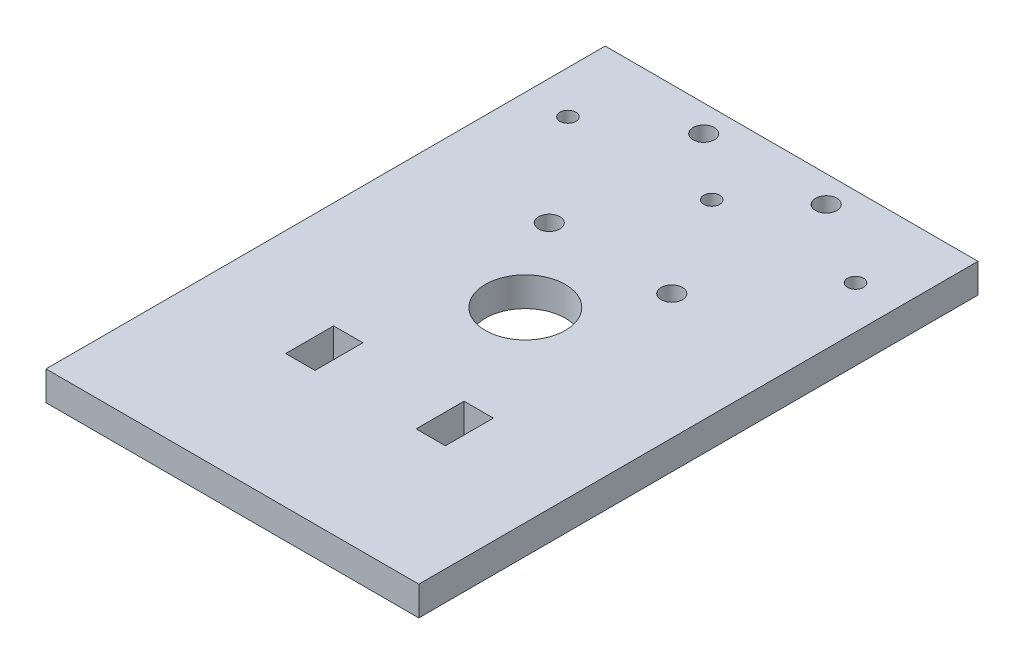
ISO-10303-21;
HEADER;
FILE_DESCRIPTION(('STEP AP214'),'2;1');
FILE_NAME('part.step','',(''),(''),'','','');
FILE_SCHEMA(('AUTOMOTIVE_DESIGN { 1 0 10303 214 1 1 1 1 }'));
ENDSEC;
DATA;
#1=APPLICATION_CONTEXT('core data for automotive mechanical design processes');
#2=APPLICATION_PROTOCOL_DEFINITION('international standard','automotive_design',2000,#1);
#3=PRODUCT_CONTEXT('',#1,'mechanical');
#4=PRODUCT('Part','Part','',(#3));
#5=PRODUCT_RELATED_PRODUCT_CATEGORY('part','',(#4));
#6=PRODUCT_DEFINITION_FORMATION('','',#4);
#7=PRODUCT_DEFINITION_CONTEXT('part definition',#1,'design');
#8=PRODUCT_DEFINITION('design','',#6,#7);
#9=PRODUCT_DEFINITION_SHAPE('','',#8);
#10=(LENGTH_UNIT() NAMED_UNIT(*) SI_UNIT(.MILLI.,.METRE.));
#11=(NAMED_UNIT(*) PLANE_ANGLE_UNIT() SI_UNIT($,.RADIAN.));
#12=(NAMED_UNIT(*) SI_UNIT($,.STERADIAN.) SOLID_ANGLE_UNIT());
#13=UNCERTAINTY_MEASURE_WITH_UNIT(LENGTH_MEASURE(1.E-05),#10,'distance_accuracy_value','');
#14=(GEOMETRIC_REPRESENTATION_CONTEXT(3) GLOBAL_UNCERTAINTY_ASSIGNED_CONTEXT((#13)) GLOBAL_UNIT_ASSIGNED_CONTEXT((#10,
#11,#12)) REPRESENTATION_CONTEXT('',''));
#15=CARTESIAN_POINT('',(0.,0.,0.));
#16=DIRECTION('',(0.,0.,1.));
#17=DIRECTION('',(1.,0.,0.));
#18=AXIS2_PLACEMENT_3D('',#15,#16,#17);
#19=CARTESIAN_POINT('',(0.,5.5,0.));
#20=DIRECTION('',(0.,1.,0.));
#21=DIRECTION('',(0.,0.,1.));
#22=AXIS2_PLACEMENT_3D('',#19,#20,#21);
#23=PLANE('',#22);
#24=CARTESIAN_POINT('',(-44.4065040650406,5.5,8.92276422764227));
#25=DIRECTION('',(0.,1.,0.));
#26=DIRECTION('',(0.,0.,-1.));
#27=AXIS2_PLACEMENT_3D('',#24,#25,#26);
#28=CIRCLE('',#27,1.5);
#29=CARTESIAN_POINT('',(-44.4065040650406,5.5,7.42276422764227));
#30=VERTEX_POINT('',#29);
#31=EDGE_CURVE('E327',#30,#30,#28,.T.);
#32=ORIENTED_EDGE('',*,*,#31,.F.);
#33=EDGE_LOOP('',(#32));
#34=FACE_BOUND('',#33,.T.);
#35=DIRECTION('',(1.,0.,0.));
#36=VECTOR('',#35,1.);
#37=CARTESIAN_POINT('',(-56.4065040650406,5.5,73.9227642276423));
#38=LINE('',#37,#36);
#39=CARTESIAN_POINT('',(-61.9065040650406,5.5,73.9227642276423));
#40=VERTEX_POINT('',#39);
#41=CARTESIAN_POINT('',(-56.4065040650406,5.5,73.9227642276423));
#42=VERTEX_POINT('',#41);
#43=EDGE_CURVE('E130',#40,#42,#38,.T.);
#44=ORIENTED_EDGE('',*,*,#43,.F.);
#45=DIRECTION('',(0.,0.,1.));
#46=VECTOR('',#45,1.);
#47=CARTESIAN_POINT('',(-61.9065040650406,5.5,73.9227642276423));
#48=LINE('',#47,#46);
#49=CARTESIAN_POINT('',(-61.9065040650406,5.5,64.9227642276423));
#50=VERTEX_POINT('',#49);
#51=EDGE_CURVE('E122',#50,#40,#48,.T.);
#52=ORIENTED_EDGE('',*,*,#51,.F.);
#53=DIRECTION('',(-1.,0.,0.));
#54=VECTOR('',#53,1.);
#55=CARTESIAN_POINT('',(-61.9065040650406,5.5,64.9227642276423));
#56=LINE('',#55,#54);
#57=CARTESIAN_POINT('',(-56.4065040650406,5.5,64.9227642276423));
#58=VERTEX_POINT('',#57);
#59=EDGE_CURVE('E145',#58,#50,#56,.T.);
#60=ORIENTED_EDGE('',*,*,#59,.F.);
#61=DIRECTION('',(0.,0.,-1.));
#62=VECTOR('',#61,1.);
#63=CARTESIAN_POINT('',(-56.4065040650406,5.5,64.9227642276423));
#64=LINE('',#63,#62);
#65=EDGE_CURVE('E143',#42,#58,#64,.T.);
#66=ORIENTED_EDGE('',*,*,#65,.F.);
#67=EDGE_LOOP('',(#44,#52,#60,#66));
#68=FACE_BOUND('',#67,.T.);
#69=DIRECTION('',(1.,0.,0.));
#70=VECTOR('',#69,1.);
#71=CARTESIAN_POINT('',(-86.4065040650406,5.5,73.9227642276423));
#72=LINE('',#71,#70);
#73=CARTESIAN_POINT('',(-86.4065040650406,5.5,73.9227642276423));
#74=VERTEX_POINT('',#73);
#75=CARTESIAN_POINT('',(-80.9065040650406,5.5,73.9227642276423));
#76=VERTEX_POINT('',#75);
#77=EDGE_CURVE('E163',#74,#76,#72,.T.);
#78=ORIENTED_EDGE('',*,*,#77,.F.);
#79=DIRECTION('',(0.,0.,1.));
#80=VECTOR('',#79,1.);
#81=CARTESIAN_POINT('',(-86.4065040650406,5.5,64.9227642276423));
#82=LINE('',#81,#80);
#83=CARTESIAN_POINT('',(-86.4065040650406,5.5,64.9227642276423));
#84=VERTEX_POINT('',#83);
#85=EDGE_CURVE('E161',#84,#74,#82,.T.);
#86=ORIENTED_EDGE('',*,*,#85,.F.);
#87=DIRECTION('',(-1.,0.,0.));
#88=VECTOR('',#87,1.);
#89=CARTESIAN_POINT('',(-80.9065040650406,5.5,64.9227642276423));
#90=LINE('',#89,#88);
#91=CARTESIAN_POINT('',(-80.9065040650406,5.5,64.9227642276423));
#92=VERTEX_POINT('',#91);
#93=EDGE_CURVE('E169',#92,#84,#90,.T.);
#94=ORIENTED_EDGE('',*,*,#93,.F.);
#95=DIRECTION('',(0.,0.,-1.));
#96=VECTOR('',#95,1.);
#97=CARTESIAN_POINT('',(-80.9065040650406,5.5,73.9227642276423));
#98=LINE('',#97,#96);
#99=EDGE_CURVE('E166',#76,#92,#98,.T.);
#100=ORIENTED_EDGE('',*,*,#99,.F.);
#101=EDGE_LOOP('',(#78,#86,#94,#100));
#102=FACE_BOUND('',#101,.T.);
#103=CARTESIAN_POINT('',(-71.4065040650406,5.5,43.9227642276423));
#104=DIRECTION('',(0.,1.,0.));
#105=DIRECTION('',(0.,0.,1.));
#106=AXIS2_PLACEMENT_3D('',#103,#104,#105);
#107=CIRCLE('',#106,7.5);
#108=CARTESIAN_POINT('',(-71.4065040650406,5.5,51.4227642276423));
#109=VERTEX_POINT('',#108);
#110=EDGE_CURVE('E192',#109,#109,#107,.T.);
#111=ORIENTED_EDGE('',*,*,#110,.F.);
#112=EDGE_LOOP('',(#111));
#113=FACE_BOUND('',#112,.T.);
#114=CARTESIAN_POINT('',(-59.9065040650406,5.5,27.9227642276423));
#115=DIRECTION('',(0.,1.,0.));
#116=DIRECTION('',(0.,0.,-1.));
#117=AXIS2_PLACEMENT_3D('',#114,#115,#116);
#118=CIRCLE('',#117,2.);
#119=CARTESIAN_POINT('',(-59.9065040650406,5.5,25.9227642276423));
#120=VERTEX_POINT('',#119);
#121=EDGE_CURVE('E204',#120,#120,#118,.T.);
#122=ORIENTED_EDGE('',*,*,#121,.F.);
#123=EDGE_LOOP('',(#122));
#124=FACE_BOUND('',#123,.T.);
#125=CARTESIAN_POINT('',(-82.9065040650406,5.5,27.9227642276423));
#126=DIRECTION('',(0.,1.,0.));
#127=DIRECTION('',(0.,0.,1.));
#128=AXIS2_PLACEMENT_3D('',#125,#126,#127);
#129=CIRCLE('',#128,2.);
#130=CARTESIAN_POINT('',(-82.9065040650406,5.5,29.9227642276423));
#131=VERTEX_POINT('',#130);
#132=EDGE_CURVE('E216',#131,#131,#129,.T.);
#133=ORIENTED_EDGE('',*,*,#132,.F.);
#134=EDGE_LOOP('',(#133));
#135=FACE_BOUND('',#134,.T.);
#136=DIRECTION('',(0.,0.,1.));
#137=VECTOR('',#136,1.);
#138=CARTESIAN_POINT('',(-106.406504065041,5.5,-6.07723577235772));
#139=LINE('',#138,#137);
#140=CARTESIAN_POINT('',(-106.406504065041,5.5,-6.07723577235772));
#141=VERTEX_POINT('',#140);
#142=CARTESIAN_POINT('',(-106.406504065041,5.5,98.9227642276423));
#143=VERTEX_POINT('',#142);
#144=EDGE_CURVE('E222',#141,#143,#139,.T.);
#145=ORIENTED_EDGE('',*,*,#144,.T.);
#146=DIRECTION('',(1.,0.,0.));
#147=VECTOR('',#146,1.);
#148=CARTESIAN_POINT('',(-106.406504065041,5.5,98.9227642276423));
#149=LINE('',#148,#147);
#150=CARTESIAN_POINT('',(-36.4065040650406,5.5,98.9227642276423));
#151=VERTEX_POINT('',#150);
#152=EDGE_CURVE('E225',#143,#151,#149,.T.);
#153=ORIENTED_EDGE('',*,*,#152,.T.);
#154=DIRECTION('',(0.,0.,-1.));
#155=VECTOR('',#154,1.);
#156=CARTESIAN_POINT('',(-36.4065040650406,5.5,98.9227642276423));
#157=LINE('',#156,#155);
#158=CARTESIAN_POINT('',(-36.4065040650406,5.5,-6.07723577235773));
#159=VERTEX_POINT('',#158);
#160=EDGE_CURVE('E228',#151,#159,#157,.T.);
#161=ORIENTED_EDGE('',*,*,#160,.T.);
#162=DIRECTION('',(-1.,0.,0.));
#163=VECTOR('',#162,1.);
#164=CARTESIAN_POINT('',(-106.406504065041,5.5,-6.07723577235772));
#165=LINE('',#164,#163);
#166=EDGE_CURVE('E230',#159,#141,#165,.T.);
#167=ORIENTED_EDGE('',*,*,#166,.T.);
#168=EDGE_LOOP('',(#145,#153,#161,#167));
#169=FACE_BOUND('',#168,.T.);
#170=CARTESIAN_POINT('',(-82.9065040650406,5.5,-1.07723577235772));
#171=DIRECTION('',(0.,1.,0.));
#172=DIRECTION('',(0.,0.,1.));
#173=AXIS2_PLACEMENT_3D('',#170,#171,#172);
#174=CIRCLE('',#173,2.);
#175=CARTESIAN_POINT('',(-82.9065040650406,5.5,0.922764227642278));
#176=VERTEX_POINT('',#175);
#177=EDGE_CURVE('E210',#176,#176,#174,.T.);
#178=ORIENTED_EDGE('',*,*,#177,.F.);
#179=EDGE_LOOP('',(#178));
#180=FACE_BOUND('',#179,.T.);
#181=CARTESIAN_POINT('',(-59.9065040650406,5.5,-1.07723577235772));
#182=DIRECTION('',(0.,1.,0.));
#183=DIRECTION('',(0.,0.,-1.));
#184=AXIS2_PLACEMENT_3D('',#181,#182,#183);
#185=CIRCLE('',#184,2.);
#186=CARTESIAN_POINT('',(-59.9065040650406,5.5,-3.07723577235772));
#187=VERTEX_POINT('',#186);
#188=EDGE_CURVE('E198',#187,#187,#185,.T.);
#189=ORIENTED_EDGE('',*,*,#188,.F.);
#190=EDGE_LOOP('',(#189));
#191=FACE_BOUND('',#190,.T.);
#192=CARTESIAN_POINT('',(-71.4065040650406,5.5,8.92276422764228));
#193=DIRECTION('',(0.,1.,0.));
#194=DIRECTION('',(0.,0.,1.));
#195=AXIS2_PLACEMENT_3D('',#192,#193,#194);
#196=CIRCLE('',#195,1.5);
#197=CARTESIAN_POINT('',(-71.4065040650406,5.5,10.4227642276423));
#198=VERTEX_POINT('',#197);
#199=EDGE_CURVE('E151',#198,#198,#196,.T.);
#200=ORIENTED_EDGE('',*,*,#199,.F.);
#201=EDGE_LOOP('',(#200));
#202=FACE_BOUND('',#201,.T.);
#203=CARTESIAN_POINT('',(-98.4065040650407,5.5,8.92276422764228));
#204=DIRECTION('',(0.,1.,0.));
#205=DIRECTION('',(0.,0.,1.));
#206=AXIS2_PLACEMENT_3D('',#203,#204,#205);
#207=CIRCLE('',#206,1.5);
#208=CARTESIAN_POINT('',(-98.4065040650407,5.5,10.4227642276423));
#209=VERTEX_POINT('',#208);
#210=EDGE_CURVE('E322',#209,#209,#207,.T.);
#211=ORIENTED_EDGE('',*,*,#210,.F.);
#212=EDGE_LOOP('',(#211));
#213=FACE_BOUND('',#212,.T.);
#214=ADVANCED_FACE('F33',(#34,#68,#102,#113,#124,#135,#169,#180,#191,#202,#213),#23,.T.);
#215=CARTESIAN_POINT('',(0.,0.,0.));
#216=DIRECTION('',(0.,1.,0.));
#217=DIRECTION('',(0.,0.,1.));
#218=AXIS2_PLACEMENT_3D('',#215,#216,#217);
#219=PLANE('',#218);
#220=DIRECTION('',(0.,0.,1.));
#221=VECTOR('',#220,1.);
#222=CARTESIAN_POINT('',(-86.4065040650406,0.,64.9227642276423));
#223=LINE('',#222,#221);
#224=CARTESIAN_POINT('',(-86.4065040650406,0.,64.9227642276423));
#225=VERTEX_POINT('',#224);
#226=CARTESIAN_POINT('',(-86.4065040650406,0.,73.9227642276423));
#227=VERTEX_POINT('',#226);
#228=EDGE_CURVE('E138',#225,#227,#223,.T.);
#229=ORIENTED_EDGE('',*,*,#228,.T.);
#230=DIRECTION('',(1.,0.,0.));
#231=VECTOR('',#230,1.);
#232=CARTESIAN_POINT('',(-86.4065040650406,0.,73.9227642276423));
#233=LINE('',#232,#231);
#234=CARTESIAN_POINT('',(-80.9065040650406,0.,73.9227642276423));
#235=VERTEX_POINT('',#234);
#236=EDGE_CURVE('E174',#227,#235,#233,.T.);
#237=ORIENTED_EDGE('',*,*,#236,.T.);
#238=DIRECTION('',(0.,0.,-1.));
#239=VECTOR('',#238,1.);
#240=CARTESIAN_POINT('',(-80.9065040650406,0.,73.9227642276423));
#241=LINE('',#240,#239);
#242=CARTESIAN_POINT('',(-80.9065040650406,0.,64.9227642276423));
#243=VERTEX_POINT('',#242);
#244=EDGE_CURVE('E177',#235,#243,#241,.T.);
#245=ORIENTED_EDGE('',*,*,#244,.T.);
#246=DIRECTION('',(-1.,0.,0.));
#247=VECTOR('',#246,1.);
#248=CARTESIAN_POINT('',(-80.9065040650406,0.,64.9227642276423));
#249=LINE('',#248,#247);
#250=EDGE_CURVE('E164',#243,#225,#249,.T.);
#251=ORIENTED_EDGE('',*,*,#250,.T.);
#252=EDGE_LOOP('',(#229,#237,#245,#251));
#253=FACE_BOUND('',#252,.T.);
#254=DIRECTION('',(0.,0.,1.));
#255=VECTOR('',#254,1.);
#256=CARTESIAN_POINT('',(-106.406504065041,0.,-6.07723577235772));
#257=LINE('',#256,#255);
#258=CARTESIAN_POINT('',(-106.406504065041,0.,-6.07723577235772));
#259=VERTEX_POINT('',#258);
#260=CARTESIAN_POINT('',(-106.406504065041,0.,98.9227642276423));
#261=VERTEX_POINT('',#260);
#262=EDGE_CURVE('E219',#259,#261,#257,.T.);
#263=ORIENTED_EDGE('',*,*,#262,.F.);
#264=DIRECTION('',(-1.,0.,0.));
#265=VECTOR('',#264,1.);
#266=CARTESIAN_POINT('',(-106.406504065041,0.,-6.07723577235772));
#267=LINE('',#266,#265);
#268=CARTESIAN_POINT('',(-36.4065040650406,0.,-6.07723577235773));
#269=VERTEX_POINT('',#268);
#270=EDGE_CURVE('E226',#269,#259,#267,.T.);
#271=ORIENTED_EDGE('',*,*,#270,.F.);
#272=DIRECTION('',(0.,0.,-1.));
#273=VECTOR('',#272,1.);
#274=CARTESIAN_POINT('',(-36.4065040650406,0.,98.9227642276423));
#275=LINE('',#274,#273);
#276=CARTESIAN_POINT('',(-36.4065040650406,0.,98.9227642276423));
#277=VERTEX_POINT('',#276);
#278=EDGE_CURVE('E237',#277,#269,#275,.T.);
#279=ORIENTED_EDGE('',*,*,#278,.F.);
#280=DIRECTION('',(1.,0.,0.));
#281=VECTOR('',#280,1.);
#282=CARTESIAN_POINT('',(-106.406504065041,0.,98.9227642276423));
#283=LINE('',#282,#281);
#284=EDGE_CURVE('E235',#261,#277,#283,.T.);
#285=ORIENTED_EDGE('',*,*,#284,.F.);
#286=EDGE_LOOP('',(#263,#271,#279,#285));
#287=FACE_BOUND('',#286,.T.);
#288=CARTESIAN_POINT('',(-82.9065040650406,0.,27.9227642276423));
#289=DIRECTION('',(0.,1.,0.));
#290=DIRECTION('',(0.,0.,1.));
#291=AXIS2_PLACEMENT_3D('',#288,#289,#290);
#292=CIRCLE('',#291,2.);
#293=CARTESIAN_POINT('',(-82.9065040650406,0.,29.9227642276423));
#294=VERTEX_POINT('',#293);
#295=EDGE_CURVE('E213',#294,#294,#292,.T.);
#296=ORIENTED_EDGE('',*,*,#295,.T.);
#297=EDGE_LOOP('',(#296));
#298=FACE_BOUND('',#297,.T.);
#299=CARTESIAN_POINT('',(-82.9065040650406,0.,-1.07723577235772));
#300=DIRECTION('',(0.,1.,0.));
#301=DIRECTION('',(0.,0.,1.));
#302=AXIS2_PLACEMENT_3D('',#299,#300,#301);
#303=CIRCLE('',#302,2.);
#304=CARTESIAN_POINT('',(-82.9065040650406,0.,0.922764227642278));
#305=VERTEX_POINT('',#304);
#306=EDGE_CURVE('E207',#305,#305,#303,.T.);
#307=ORIENTED_EDGE('',*,*,#306,.T.);
#308=EDGE_LOOP('',(#307));
#309=FACE_BOUND('',#308,.T.);
#310=CARTESIAN_POINT('',(-59.9065040650406,0.,27.9227642276423));
#311=DIRECTION('',(0.,1.,0.));
#312=DIRECTION('',(0.,0.,-1.));
#313=AXIS2_PLACEMENT_3D('',#310,#311,#312);
#314=CIRCLE('',#313,2.);
#315=CARTESIAN_POINT('',(-59.9065040650406,0.,25.9227642276423));
#316=VERTEX_POINT('',#315);
#317=EDGE_CURVE('E201',#316,#316,#314,.T.);
#318=ORIENTED_EDGE('',*,*,#317,.T.);
#319=EDGE_LOOP('',(#318));
#320=FACE_BOUND('',#319,.T.);
#321=CARTESIAN_POINT('',(-59.9065040650406,0.,-1.07723577235772));
#322=DIRECTION('',(0.,1.,0.));
#323=DIRECTION('',(0.,0.,-1.));
#324=AXIS2_PLACEMENT_3D('',#321,#322,#323);
#325=CIRCLE('',#324,2.);
#326=CARTESIAN_POINT('',(-59.9065040650406,0.,-3.07723577235772));
#327=VERTEX_POINT('',#326);
#328=EDGE_CURVE('E195',#327,#327,#325,.T.);
#329=ORIENTED_EDGE('',*,*,#328,.T.);
#330=EDGE_LOOP('',(#329));
#331=FACE_BOUND('',#330,.T.);
#332=CARTESIAN_POINT('',(-71.4065040650406,0.,43.9227642276423));
#333=DIRECTION('',(0.,1.,0.));
#334=DIRECTION('',(0.,0.,1.));
#335=AXIS2_PLACEMENT_3D('',#332,#333,#334);
#336=CIRCLE('',#335,7.5);
#337=CARTESIAN_POINT('',(-71.4065040650406,0.,51.4227642276423));
#338=VERTEX_POINT('',#337);
#339=EDGE_CURVE('E191',#338,#338,#336,.T.);
#340=ORIENTED_EDGE('',*,*,#339,.T.);
#341=EDGE_LOOP('',(#340));
#342=FACE_BOUND('',#341,.T.);
#343=DIRECTION('',(0.,0.,1.));
#344=VECTOR('',#343,1.);
#345=CARTESIAN_POINT('',(-61.9065040650406,0.,73.9227642276423));
#346=LINE('',#345,#344);
#347=CARTESIAN_POINT('',(-61.9065040650406,0.,64.9227642276423));
#348=VERTEX_POINT('',#347);
#349=CARTESIAN_POINT('',(-61.9065040650406,0.,73.9227642276423));
#350=VERTEX_POINT('',#349);
#351=EDGE_CURVE('E56',#348,#350,#346,.T.);
#352=ORIENTED_EDGE('',*,*,#351,.T.);
#353=DIRECTION('',(1.,0.,0.));
#354=VECTOR('',#353,1.);
#355=CARTESIAN_POINT('',(-56.4065040650406,0.,73.9227642276423));
#356=LINE('',#355,#354);
#357=CARTESIAN_POINT('',(-56.4065040650406,0.,73.9227642276423));
#358=VERTEX_POINT('',#357);
#359=EDGE_CURVE('E137',#350,#358,#356,.T.);
#360=ORIENTED_EDGE('',*,*,#359,.T.);
#361=DIRECTION('',(0.,0.,-1.));
#362=VECTOR('',#361,1.);
#363=CARTESIAN_POINT('',(-56.4065040650406,0.,64.9227642276423));
#364=LINE('',#363,#362);
#365=CARTESIAN_POINT('',(-56.4065040650406,0.,64.9227642276423));
#366=VERTEX_POINT('',#365);
#367=EDGE_CURVE('E153',#358,#366,#364,.T.);
#368=ORIENTED_EDGE('',*,*,#367,.T.);
#369=DIRECTION('',(-1.,0.,0.));
#370=VECTOR('',#369,1.);
#371=CARTESIAN_POINT('',(-61.9065040650406,0.,64.9227642276423));
#372=LINE('',#371,#370);
#373=EDGE_CURVE('E131',#366,#348,#372,.T.);
#374=ORIENTED_EDGE('',*,*,#373,.T.);
#375=EDGE_LOOP('',(#352,#360,#368,#374));
#376=FACE_BOUND('',#375,.T.);
#377=CARTESIAN_POINT('',(-71.4065040650406,0.,8.92276422764228));
#378=DIRECTION('',(0.,1.,0.));
#379=DIRECTION('',(0.,0.,1.));
#380=AXIS2_PLACEMENT_3D('',#377,#378,#379);
#381=CIRCLE('',#380,1.5);
#382=CARTESIAN_POINT('',(-71.4065040650406,0.,10.4227642276423));
#383=VERTEX_POINT('',#382);
#384=EDGE_CURVE('E313',#383,#383,#381,.T.);
#385=ORIENTED_EDGE('',*,*,#384,.T.);
#386=EDGE_LOOP('',(#385));
#387=FACE_BOUND('',#386,.T.);
#388=CARTESIAN_POINT('',(-44.4065040650406,0.,8.92276422764227));
#389=DIRECTION('',(0.,1.,0.));
#390=DIRECTION('',(0.,0.,-1.));
#391=AXIS2_PLACEMENT_3D('',#388,#389,#390);
#392=CIRCLE('',#391,1.5);
#393=CARTESIAN_POINT('',(-44.4065040650406,0.,7.42276422764227));
#394=VERTEX_POINT('',#393);
#395=EDGE_CURVE('E317',#394,#394,#392,.T.);
#396=ORIENTED_EDGE('',*,*,#395,.T.);
#397=EDGE_LOOP('',(#396));
#398=FACE_BOUND('',#397,.T.);
#399=CARTESIAN_POINT('',(-98.4065040650407,0.,8.92276422764228));
#400=DIRECTION('',(0.,1.,0.));
#401=DIRECTION('',(0.,0.,1.));
#402=AXIS2_PLACEMENT_3D('',#399,#400,#401);
#403=CIRCLE('',#402,1.5);
#404=CARTESIAN_POINT('',(-98.4065040650407,0.,10.4227642276423));
#405=VERTEX_POINT('',#404);
#406=EDGE_CURVE('E320',#405,#405,#403,.T.);
#407=ORIENTED_EDGE('',*,*,#406,.T.);
#408=EDGE_LOOP('',(#407));
#409=FACE_BOUND('',#408,.T.);
#410=ADVANCED_FACE('F255',(#253,#287,#298,#309,#320,#331,#342,#376,#387,#398,#409),#219,.F.);
#411=CARTESIAN_POINT('',(-106.406504065041,5.5,-6.07723577235772));
#412=DIRECTION('',(1.,0.,0.));
#413=DIRECTION('',(0.,0.,-1.));
#414=AXIS2_PLACEMENT_3D('',#411,#412,#413);
#415=PLANE('',#414);
#416=ORIENTED_EDGE('',*,*,#262,.T.);
#417=DIRECTION('',(0.,-1.,0.));
#418=VECTOR('',#417,1.);
#419=CARTESIAN_POINT('',(-106.406504065041,5.5,98.9227642276423));
#420=LINE('',#419,#418);
#421=EDGE_CURVE('E11',#143,#261,#420,.T.);
#422=ORIENTED_EDGE('',*,*,#421,.F.);
#423=ORIENTED_EDGE('',*,*,#144,.F.);
#424=DIRECTION('',(0.,-1.,0.));
#425=VECTOR('',#424,1.);
#426=CARTESIAN_POINT('',(-106.406504065041,5.5,-6.07723577235772));
#427=LINE('',#426,#425);
#428=EDGE_CURVE('E232',#141,#259,#427,.T.);
#429=ORIENTED_EDGE('',*,*,#428,.T.);
#430=EDGE_LOOP('',(#416,#422,#423,#429));
#431=FACE_BOUND('',#430,.T.);
#432=ADVANCED_FACE('F35',(#431),#415,.F.);
#433=CARTESIAN_POINT('',(-106.406504065041,5.5,98.9227642276423));
#434=DIRECTION('',(0.,0.,-1.));
#435=DIRECTION('',(-1.,0.,0.));
#436=AXIS2_PLACEMENT_3D('',#433,#434,#435);
#437=PLANE('',#436);
#438=ORIENTED_EDGE('',*,*,#284,.T.);
#439=DIRECTION('',(0.,-1.,0.));
#440=VECTOR('',#439,1.);
#441=CARTESIAN_POINT('',(-36.4065040650406,5.5,98.9227642276423));
#442=LINE('',#441,#440);
#443=EDGE_CURVE('E41',#151,#277,#442,.T.);
#444=ORIENTED_EDGE('',*,*,#443,.F.);
#445=ORIENTED_EDGE('',*,*,#152,.F.);
#446=ORIENTED_EDGE('',*,*,#421,.T.);
#447=EDGE_LOOP('',(#438,#444,#445,#446));
#448=FACE_BOUND('',#447,.T.);
#449=ADVANCED_FACE('F266',(#448),#437,.F.);
#450=CARTESIAN_POINT('',(-36.4065040650406,5.5,98.9227642276423));
#451=DIRECTION('',(-1.,0.,0.));
#452=DIRECTION('',(0.,0.,1.));
#453=AXIS2_PLACEMENT_3D('',#450,#451,#452);
#454=PLANE('',#453);
#455=ORIENTED_EDGE('',*,*,#278,.T.);
#456=DIRECTION('',(0.,-1.,0.));
#457=VECTOR('',#456,1.);
#458=CARTESIAN_POINT('',(-36.4065040650406,5.5,-6.07723577235773));
#459=LINE('',#458,#457);
#460=EDGE_CURVE('E242',#159,#269,#459,.T.);
#461=ORIENTED_EDGE('',*,*,#460,.F.);
#462=ORIENTED_EDGE('',*,*,#160,.F.);
#463=ORIENTED_EDGE('',*,*,#443,.T.);
#464=EDGE_LOOP('',(#455,#461,#462,#463));
#465=FACE_BOUND('',#464,.T.);
#466=ADVANCED_FACE('F249',(#465),#454,.F.);
#467=CARTESIAN_POINT('',(-106.406504065041,5.5,-6.07723577235772));
#468=DIRECTION('',(0.,0.,1.));
#469=DIRECTION('',(1.,0.,0.));
#470=AXIS2_PLACEMENT_3D('',#467,#468,#469);
#471=PLANE('',#470);
#472=ORIENTED_EDGE('',*,*,#270,.T.);
#473=ORIENTED_EDGE('',*,*,#428,.F.);
#474=ORIENTED_EDGE('',*,*,#166,.F.);
#475=ORIENTED_EDGE('',*,*,#460,.T.);
#476=EDGE_LOOP('',(#472,#473,#474,#475));
#477=FACE_BOUND('',#476,.T.);
#478=ADVANCED_FACE('F259',(#477),#471,.F.);
#479=CARTESIAN_POINT('',(-82.9065040650406,5.5,27.9227642276423));
#480=DIRECTION('',(0.,-1.,0.));
#481=DIRECTION('',(0.,0.,-1.));
#482=AXIS2_PLACEMENT_3D('',#479,#480,#481);
#483=CYLINDRICAL_SURFACE('',#482,2.);
#484=ORIENTED_EDGE('',*,*,#132,.T.);
#485=EDGE_LOOP('',(#484));
#486=FACE_BOUND('',#485,.T.);
#487=ORIENTED_EDGE('',*,*,#295,.F.);
#488=EDGE_LOOP('',(#487));
#489=FACE_BOUND('',#488,.T.);
#490=ADVANCED_FACE('F283',(#486,#489),#483,.F.);
#491=CARTESIAN_POINT('',(-82.9065040650406,5.5,-1.07723577235772));
#492=DIRECTION('',(0.,-1.,0.));
#493=DIRECTION('',(0.,0.,-1.));
#494=AXIS2_PLACEMENT_3D('',#491,#492,#493);
#495=CYLINDRICAL_SURFACE('',#494,2.);
#496=ORIENTED_EDGE('',*,*,#177,.T.);
#497=EDGE_LOOP('',(#496));
#498=FACE_BOUND('',#497,.T.);
#499=ORIENTED_EDGE('',*,*,#306,.F.);
#500=EDGE_LOOP('',(#499));
#501=FACE_BOUND('',#500,.T.);
#502=ADVANCED_FACE('F290',(#498,#501),#495,.F.);
#503=CARTESIAN_POINT('',(-59.9065040650406,5.5,27.9227642276423));
#504=DIRECTION('',(0.,-1.,0.));
#505=DIRECTION('',(0.,0.,-1.));
#506=AXIS2_PLACEMENT_3D('',#503,#504,#505);
#507=CYLINDRICAL_SURFACE('',#506,2.);
#508=ORIENTED_EDGE('',*,*,#121,.T.);
#509=EDGE_LOOP('',(#508));
#510=FACE_BOUND('',#509,.T.);
#511=ORIENTED_EDGE('',*,*,#317,.F.);
#512=EDGE_LOOP('',(#511));
#513=FACE_BOUND('',#512,.T.);
#514=ADVANCED_FACE('F295',(#510,#513),#507,.F.);
#515=CARTESIAN_POINT('',(-59.9065040650406,5.5,-1.07723577235772));
#516=DIRECTION('',(0.,-1.,0.));
#517=DIRECTION('',(0.,0.,-1.));
#518=AXIS2_PLACEMENT_3D('',#515,#516,#517);
#519=CYLINDRICAL_SURFACE('',#518,2.);
#520=ORIENTED_EDGE('',*,*,#188,.T.);
#521=EDGE_LOOP('',(#520));
#522=FACE_BOUND('',#521,.T.);
#523=ORIENTED_EDGE('',*,*,#328,.F.);
#524=EDGE_LOOP('',(#523));
#525=FACE_BOUND('',#524,.T.);
#526=ADVANCED_FACE('F382',(#522,#525),#519,.F.);
#527=CARTESIAN_POINT('',(-71.4065040650406,5.5,43.9227642276423));
#528=DIRECTION('',(0.,-1.,0.));
#529=DIRECTION('',(0.,0.,-1.));
#530=AXIS2_PLACEMENT_3D('',#527,#528,#529);
#531=CYLINDRICAL_SURFACE('',#530,7.5);
#532=ORIENTED_EDGE('',*,*,#110,.T.);
#533=EDGE_LOOP('',(#532));
#534=FACE_BOUND('',#533,.T.);
#535=ORIENTED_EDGE('',*,*,#339,.F.);
#536=EDGE_LOOP('',(#535));
#537=FACE_BOUND('',#536,.T.);
#538=ADVANCED_FACE('F378',(#534,#537),#531,.F.);
#539=CARTESIAN_POINT('',(-86.4065040650406,5.5,64.9227642276423));
#540=DIRECTION('',(1.,0.,0.));
#541=DIRECTION('',(0.,0.,-1.));
#542=AXIS2_PLACEMENT_3D('',#539,#540,#541);
#543=PLANE('',#542);
#544=ORIENTED_EDGE('',*,*,#228,.F.);
#545=DIRECTION('',(0.,-1.,0.));
#546=VECTOR('',#545,1.);
#547=CARTESIAN_POINT('',(-86.4065040650406,5.5,64.9227642276423));
#548=LINE('',#547,#546);
#549=EDGE_CURVE('E171',#84,#225,#548,.T.);
#550=ORIENTED_EDGE('',*,*,#549,.F.);
#551=ORIENTED_EDGE('',*,*,#85,.T.);
#552=DIRECTION('',(0.,-1.,0.));
#553=VECTOR('',#552,1.);
#554=CARTESIAN_POINT('',(-86.4065040650406,5.5,73.9227642276423));
#555=LINE('',#554,#553);
#556=EDGE_CURVE('E188',#74,#227,#555,.T.);
#557=ORIENTED_EDGE('',*,*,#556,.T.);
#558=EDGE_LOOP('',(#544,#550,#551,#557));
#559=FACE_BOUND('',#558,.T.);
#560=ADVANCED_FACE('F374',(#559),#543,.T.);
#561=CARTESIAN_POINT('',(-86.4065040650406,5.5,73.9227642276423));
#562=DIRECTION('',(0.,0.,-1.));
#563=DIRECTION('',(-1.,0.,0.));
#564=AXIS2_PLACEMENT_3D('',#561,#562,#563);
#565=PLANE('',#564);
#566=ORIENTED_EDGE('',*,*,#236,.F.);
#567=ORIENTED_EDGE('',*,*,#556,.F.);
#568=ORIENTED_EDGE('',*,*,#77,.T.);
#569=DIRECTION('',(0.,-1.,0.));
#570=VECTOR('',#569,1.);
#571=CARTESIAN_POINT('',(-80.9065040650406,5.5,73.9227642276423));
#572=LINE('',#571,#570);
#573=EDGE_CURVE('E186',#76,#235,#572,.T.);
#574=ORIENTED_EDGE('',*,*,#573,.T.);
#575=EDGE_LOOP('',(#566,#567,#568,#574));
#576=FACE_BOUND('',#575,.T.);
#577=ADVANCED_FACE('F370',(#576),#565,.T.);
#578=CARTESIAN_POINT('',(-80.9065040650406,5.5,73.9227642276423));
#579=DIRECTION('',(-1.,0.,0.));
#580=DIRECTION('',(0.,0.,1.));
#581=AXIS2_PLACEMENT_3D('',#578,#579,#580);
#582=PLANE('',#581);
#583=ORIENTED_EDGE('',*,*,#244,.F.);
#584=ORIENTED_EDGE('',*,*,#573,.F.);
#585=ORIENTED_EDGE('',*,*,#99,.T.);
#586=DIRECTION('',(0.,-1.,0.));
#587=VECTOR('',#586,1.);
#588=CARTESIAN_POINT('',(-80.9065040650406,5.5,64.9227642276423));
#589=LINE('',#588,#587);
#590=EDGE_CURVE('E184',#92,#243,#589,.T.);
#591=ORIENTED_EDGE('',*,*,#590,.T.);
#592=EDGE_LOOP('',(#583,#584,#585,#591));
#593=FACE_BOUND('',#592,.T.);
#594=ADVANCED_FACE('F366',(#593),#582,.T.);
#595=CARTESIAN_POINT('',(-80.9065040650406,5.5,64.9227642276423));
#596=DIRECTION('',(0.,0.,1.));
#597=DIRECTION('',(1.,0.,0.));
#598=AXIS2_PLACEMENT_3D('',#595,#596,#597);
#599=PLANE('',#598);
#600=ORIENTED_EDGE('',*,*,#250,.F.);
#601=ORIENTED_EDGE('',*,*,#590,.F.);
#602=ORIENTED_EDGE('',*,*,#93,.T.);
#603=ORIENTED_EDGE('',*,*,#549,.T.);
#604=EDGE_LOOP('',(#600,#601,#602,#603));
#605=FACE_BOUND('',#604,.T.);
#606=ADVANCED_FACE('F363',(#605),#599,.T.);
#607=CARTESIAN_POINT('',(-61.9065040650406,5.5,73.9227642276423));
#608=DIRECTION('',(1.,0.,0.));
#609=DIRECTION('',(0.,0.,-1.));
#610=AXIS2_PLACEMENT_3D('',#607,#608,#609);
#611=PLANE('',#610);
#612=ORIENTED_EDGE('',*,*,#351,.F.);
#613=DIRECTION('',(0.,-1.,0.));
#614=VECTOR('',#613,1.);
#615=CARTESIAN_POINT('',(-61.9065040650406,5.5,64.9227642276423));
#616=LINE('',#615,#614);
#617=EDGE_CURVE('E126',#50,#348,#616,.T.);
#618=ORIENTED_EDGE('',*,*,#617,.F.);
#619=ORIENTED_EDGE('',*,*,#51,.T.);
#620=DIRECTION('',(0.,-1.,0.));
#621=VECTOR('',#620,1.);
#622=CARTESIAN_POINT('',(-61.9065040650406,5.5,73.9227642276423));
#623=LINE('',#622,#621);
#624=EDGE_CURVE('E125',#40,#350,#623,.T.);
#625=ORIENTED_EDGE('',*,*,#624,.T.);
#626=EDGE_LOOP('',(#612,#618,#619,#625));
#627=FACE_BOUND('',#626,.T.);
#628=ADVANCED_FACE('F124',(#627),#611,.T.);
#629=CARTESIAN_POINT('',(-56.4065040650406,5.5,73.9227642276423));
#630=DIRECTION('',(0.,0.,-1.));
#631=DIRECTION('',(-1.,0.,0.));
#632=AXIS2_PLACEMENT_3D('',#629,#630,#631);
#633=PLANE('',#632);
#634=ORIENTED_EDGE('',*,*,#359,.F.);
#635=ORIENTED_EDGE('',*,*,#624,.F.);
#636=ORIENTED_EDGE('',*,*,#43,.T.);
#637=DIRECTION('',(0.,-1.,0.));
#638=VECTOR('',#637,1.);
#639=CARTESIAN_POINT('',(-56.4065040650406,5.5,73.9227642276423));
#640=LINE('',#639,#638);
#641=EDGE_CURVE('E139',#42,#358,#640,.T.);
#642=ORIENTED_EDGE('',*,*,#641,.T.);
#643=EDGE_LOOP('',(#634,#635,#636,#642));
#644=FACE_BOUND('',#643,.T.);
#645=ADVANCED_FACE('F134',(#644),#633,.T.);
#646=CARTESIAN_POINT('',(-56.4065040650406,5.5,64.9227642276423));
#647=DIRECTION('',(-1.,0.,0.));
#648=DIRECTION('',(0.,0.,1.));
#649=AXIS2_PLACEMENT_3D('',#646,#647,#648);
#650=PLANE('',#649);
#651=ORIENTED_EDGE('',*,*,#367,.F.);
#652=ORIENTED_EDGE('',*,*,#641,.F.);
#653=ORIENTED_EDGE('',*,*,#65,.T.);
#654=DIRECTION('',(0.,-1.,0.));
#655=VECTOR('',#654,1.);
#656=CARTESIAN_POINT('',(-56.4065040650406,5.5,64.9227642276423));
#657=LINE('',#656,#655);
#658=EDGE_CURVE('E48',#58,#366,#657,.T.);
#659=ORIENTED_EDGE('',*,*,#658,.T.);
#660=EDGE_LOOP('',(#651,#652,#653,#659));
#661=FACE_BOUND('',#660,.T.);
#662=ADVANCED_FACE('F355',(#661),#650,.T.);
#663=CARTESIAN_POINT('',(-61.9065040650406,5.5,64.9227642276423));
#664=DIRECTION('',(0.,0.,1.));
#665=DIRECTION('',(1.,0.,0.));
#666=AXIS2_PLACEMENT_3D('',#663,#664,#665);
#667=PLANE('',#666);
#668=ORIENTED_EDGE('',*,*,#373,.F.);
#669=ORIENTED_EDGE('',*,*,#658,.F.);
#670=ORIENTED_EDGE('',*,*,#59,.T.);
#671=ORIENTED_EDGE('',*,*,#617,.T.);
#672=EDGE_LOOP('',(#668,#669,#670,#671));
#673=FACE_BOUND('',#672,.T.);
#674=ADVANCED_FACE('F352',(#673),#667,.T.);
#675=CARTESIAN_POINT('',(-71.4065040650406,5.5,8.92276422764228));
#676=DIRECTION('',(0.,-1.,0.));
#677=DIRECTION('',(0.,0.,-1.));
#678=AXIS2_PLACEMENT_3D('',#675,#676,#677);
#679=CYLINDRICAL_SURFACE('',#678,1.5);
#680=ORIENTED_EDGE('',*,*,#199,.T.);
#681=EDGE_LOOP('',(#680));
#682=FACE_BOUND('',#681,.T.);
#683=ORIENTED_EDGE('',*,*,#384,.F.);
#684=EDGE_LOOP('',(#683));
#685=FACE_BOUND('',#684,.T.);
#686=ADVANCED_FACE('F334',(#682,#685),#679,.F.);
#687=CARTESIAN_POINT('',(-44.4065040650406,5.5,8.92276422764227));
#688=DIRECTION('',(0.,-1.,0.));
#689=DIRECTION('',(0.,0.,-1.));
#690=AXIS2_PLACEMENT_3D('',#687,#688,#689);
#691=CYLINDRICAL_SURFACE('',#690,1.5);
#692=ORIENTED_EDGE('',*,*,#31,.T.);
#693=EDGE_LOOP('',(#692));
#694=FACE_BOUND('',#693,.T.);
#695=ORIENTED_EDGE('',*,*,#395,.F.);
#696=EDGE_LOOP('',(#695));
#697=FACE_BOUND('',#696,.T.);
#698=ADVANCED_FACE('F342',(#694,#697),#691,.F.);
#699=CARTESIAN_POINT('',(-98.4065040650407,5.5,8.92276422764228));
#700=DIRECTION('',(0.,-1.,0.));
#701=DIRECTION('',(0.,0.,-1.));
#702=AXIS2_PLACEMENT_3D('',#699,#700,#701);
#703=CYLINDRICAL_SURFACE('',#702,1.5);
#704=ORIENTED_EDGE('',*,*,#210,.T.);
#705=EDGE_LOOP('',(#704));
#706=FACE_BOUND('',#705,.T.);
#707=ORIENTED_EDGE('',*,*,#406,.F.);
#708=EDGE_LOOP('',(#707));
#709=FACE_BOUND('',#708,.T.);
#710=ADVANCED_FACE('F340',(#706,#709),#703,.F.);
#711=CLOSED_SHELL('',(#214,#410,#432,#449,#466,#478,#490,#502,#514,#526,#538,#560,#577,#594,
#606,#628,#645,#662,#674,#686,#698,#710));
#712=MANIFOLD_SOLID_BREP('B2',#711);
#713=ADVANCED_BREP_SHAPE_REPRESENTATION('',(#18,#712),#14);
#714=SHAPE_DEFINITION_REPRESENTATION(#9,#713);
ENDSEC;
END-ISO-10303-21;
